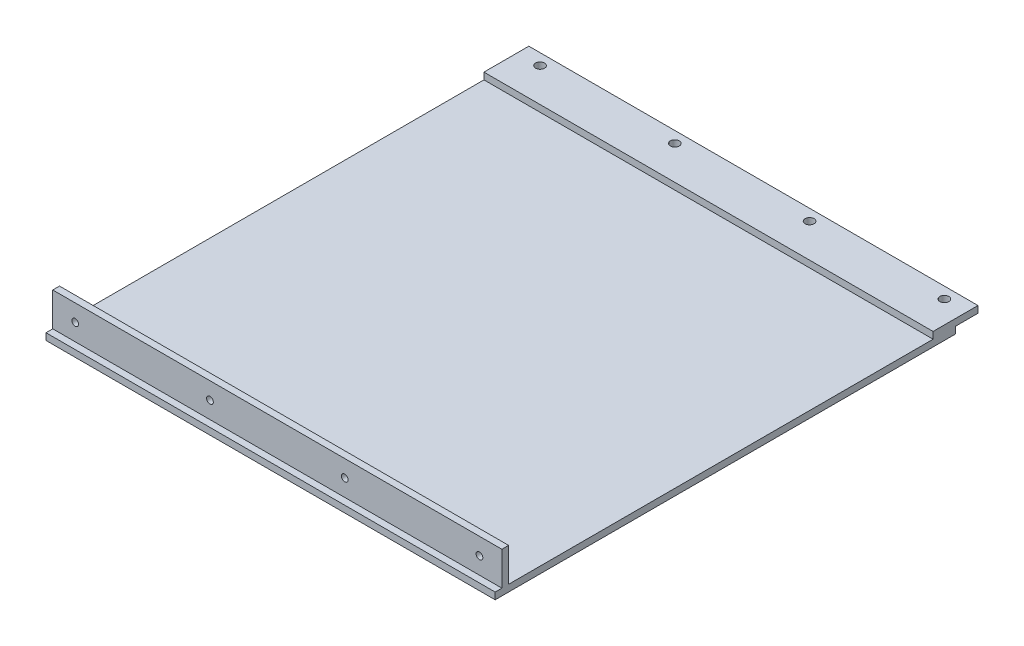
ISO-10303-21;
HEADER;
FILE_DESCRIPTION(('STEP AP214'),'2;1');
FILE_NAME('part.step','',(''),(''),'','','');
FILE_SCHEMA(('AUTOMOTIVE_DESIGN { 1 0 10303 214 1 1 1 1 }'));
ENDSEC;
DATA;
#1=APPLICATION_CONTEXT('core data for automotive mechanical design processes');
#2=APPLICATION_PROTOCOL_DEFINITION('international standard','automotive_design',2000,#1);
#3=PRODUCT_CONTEXT('',#1,'mechanical');
#4=PRODUCT('Part','Part','',(#3));
#5=PRODUCT_RELATED_PRODUCT_CATEGORY('part','',(#4));
#6=PRODUCT_DEFINITION_FORMATION('','',#4);
#7=PRODUCT_DEFINITION_CONTEXT('part definition',#1,'design');
#8=PRODUCT_DEFINITION('design','',#6,#7);
#9=PRODUCT_DEFINITION_SHAPE('','',#8);
#10=(LENGTH_UNIT() NAMED_UNIT(*) SI_UNIT(.MILLI.,.METRE.));
#11=(NAMED_UNIT(*) PLANE_ANGLE_UNIT() SI_UNIT($,.RADIAN.));
#12=(NAMED_UNIT(*) SI_UNIT($,.STERADIAN.) SOLID_ANGLE_UNIT());
#13=UNCERTAINTY_MEASURE_WITH_UNIT(LENGTH_MEASURE(1.E-05),#10,'distance_accuracy_value','');
#14=(GEOMETRIC_REPRESENTATION_CONTEXT(3) GLOBAL_UNCERTAINTY_ASSIGNED_CONTEXT((#13)) GLOBAL_UNIT_ASSIGNED_CONTEXT((#10,
#11,#12)) REPRESENTATION_CONTEXT('',''));
#15=CARTESIAN_POINT('',(0.,0.,0.));
#16=DIRECTION('',(0.,0.,1.));
#17=DIRECTION('',(1.,0.,0.));
#18=AXIS2_PLACEMENT_3D('',#15,#16,#17);
#19=CARTESIAN_POINT('',(0.,3.,0.));
#20=DIRECTION('',(0.,1.,0.));
#21=DIRECTION('',(0.,0.,1.));
#22=AXIS2_PLACEMENT_3D('',#19,#20,#21);
#23=PLANE('',#22);
#24=DIRECTION('',(0.,0.,-1.));
#25=VECTOR('',#24,1.);
#26=CARTESIAN_POINT('',(100.,3.,102.5));
#27=LINE('',#26,#25);
#28=CARTESIAN_POINT('',(100.,3.,102.5));
#29=VERTEX_POINT('',#28);
#30=CARTESIAN_POINT('',(100.,3.,99.5));
#31=VERTEX_POINT('',#30);
#32=EDGE_CURVE('E248',#29,#31,#27,.T.);
#33=ORIENTED_EDGE('',*,*,#32,.T.);
#34=DIRECTION('',(1.,0.,0.));
#35=VECTOR('',#34,1.);
#36=CARTESIAN_POINT('',(-100.,3.,99.5));
#37=LINE('',#36,#35);
#38=CARTESIAN_POINT('',(-100.,3.,99.5));
#39=VERTEX_POINT('',#38);
#40=EDGE_CURVE('E312',#39,#31,#37,.T.);
#41=ORIENTED_EDGE('',*,*,#40,.F.);
#42=DIRECTION('',(0.,0.,-1.));
#43=VECTOR('',#42,1.);
#44=CARTESIAN_POINT('',(-100.,3.,102.5));
#45=LINE('',#44,#43);
#46=CARTESIAN_POINT('',(-100.,3.,102.5));
#47=VERTEX_POINT('',#46);
#48=EDGE_CURVE('E159',#47,#39,#45,.T.);
#49=ORIENTED_EDGE('',*,*,#48,.F.);
#50=DIRECTION('',(1.,0.,0.));
#51=VECTOR('',#50,1.);
#52=CARTESIAN_POINT('',(-100.,3.,102.5));
#53=LINE('',#52,#51);
#54=EDGE_CURVE('E242',#47,#29,#53,.T.);
#55=ORIENTED_EDGE('',*,*,#54,.T.);
#56=EDGE_LOOP('',(#33,#41,#49,#55));
#57=FACE_BOUND('',#56,.T.);
#58=ADVANCED_FACE('F42',(#57),#23,.T.);
#59=CARTESIAN_POINT('',(-100.,3.,96.5));
#60=VERTEX_POINT('',#59);
#61=CARTESIAN_POINT('',(-100.,3.,-92.5));
#62=VERTEX_POINT('',#61);
#63=EDGE_CURVE('E66',#60,#62,#45,.T.);
#64=ORIENTED_EDGE('',*,*,#63,.F.);
#65=DIRECTION('',(-1.,0.,0.));
#66=VECTOR('',#65,1.);
#67=CARTESIAN_POINT('',(-100.,3.,96.5));
#68=LINE('',#67,#66);
#69=CARTESIAN_POINT('',(100.,3.,96.5));
#70=VERTEX_POINT('',#69);
#71=EDGE_CURVE('E153',#70,#60,#68,.T.);
#72=ORIENTED_EDGE('',*,*,#71,.F.);
#73=CARTESIAN_POINT('',(100.,3.,-92.5));
#74=VERTEX_POINT('',#73);
#75=EDGE_CURVE('E246',#70,#74,#27,.T.);
#76=ORIENTED_EDGE('',*,*,#75,.T.);
#77=DIRECTION('',(1.,0.,0.));
#78=VECTOR('',#77,1.);
#79=CARTESIAN_POINT('',(-100.,3.,-92.5));
#80=LINE('',#79,#78);
#81=EDGE_CURVE('E217',#62,#74,#80,.T.);
#82=ORIENTED_EDGE('',*,*,#81,.F.);
#83=EDGE_LOOP('',(#64,#72,#76,#82));
#84=FACE_BOUND('',#83,.T.);
#85=ADVANCED_FACE('F308',(#84),#23,.T.);
#86=CARTESIAN_POINT('',(-100.,3.,102.5));
#87=DIRECTION('',(0.,0.,-1.));
#88=DIRECTION('',(-1.,0.,0.));
#89=AXIS2_PLACEMENT_3D('',#86,#87,#88);
#90=PLANE('',#89);
#91=DIRECTION('',(1.,0.,0.));
#92=VECTOR('',#91,1.);
#93=CARTESIAN_POINT('',(-100.,0.,102.5));
#94=LINE('',#93,#92);
#95=CARTESIAN_POINT('',(-100.,0.,102.5));
#96=VERTEX_POINT('',#95);
#97=CARTESIAN_POINT('',(100.,0.,102.5));
#98=VERTEX_POINT('',#97);
#99=EDGE_CURVE('E241',#96,#98,#94,.T.);
#100=ORIENTED_EDGE('',*,*,#99,.T.);
#101=DIRECTION('',(0.,-1.,0.));
#102=VECTOR('',#101,1.);
#103=CARTESIAN_POINT('',(100.,3.,102.5));
#104=LINE('',#103,#102);
#105=EDGE_CURVE('E11',#29,#98,#104,.T.);
#106=ORIENTED_EDGE('',*,*,#105,.F.);
#107=ORIENTED_EDGE('',*,*,#54,.F.);
#108=DIRECTION('',(0.,-1.,0.));
#109=VECTOR('',#108,1.);
#110=CARTESIAN_POINT('',(-100.,3.,102.5));
#111=LINE('',#110,#109);
#112=EDGE_CURVE('E258',#47,#96,#111,.T.);
#113=ORIENTED_EDGE('',*,*,#112,.T.);
#114=EDGE_LOOP('',(#100,#106,#107,#113));
#115=FACE_BOUND('',#114,.T.);
#116=ADVANCED_FACE('F44',(#115),#90,.F.);
#117=CARTESIAN_POINT('',(100.,3.,102.5));
#118=DIRECTION('',(-1.,0.,0.));
#119=DIRECTION('',(0.,0.,1.));
#120=AXIS2_PLACEMENT_3D('',#117,#118,#119);
#121=PLANE('',#120);
#122=DIRECTION('',(0.,0.,-1.));
#123=VECTOR('',#122,1.);
#124=CARTESIAN_POINT('',(100.,0.,102.5));
#125=LINE('',#124,#123);
#126=CARTESIAN_POINT('',(100.,0.,-102.5));
#127=VERTEX_POINT('',#126);
#128=EDGE_CURVE('E262',#98,#127,#125,.T.);
#129=ORIENTED_EDGE('',*,*,#128,.T.);
#130=DIRECTION('',(0.,-1.,0.));
#131=VECTOR('',#130,1.);
#132=CARTESIAN_POINT('',(100.,3.,-102.5));
#133=LINE('',#132,#131);
#134=CARTESIAN_POINT('',(100.,3.,-102.5));
#135=VERTEX_POINT('',#134);
#136=EDGE_CURVE('E51',#135,#127,#133,.T.);
#137=ORIENTED_EDGE('',*,*,#136,.F.);
#138=DIRECTION('',(0.,0.,-1.));
#139=VECTOR('',#138,1.);
#140=CARTESIAN_POINT('',(100.,3.,-92.5));
#141=LINE('',#140,#139);
#142=CARTESIAN_POINT('',(100.,3.,-112.5));
#143=VERTEX_POINT('',#142);
#144=EDGE_CURVE('E221',#135,#143,#141,.T.);
#145=ORIENTED_EDGE('',*,*,#144,.T.);
#146=DIRECTION('',(0.,-1.,0.));
#147=VECTOR('',#146,1.);
#148=CARTESIAN_POINT('',(100.,6.,-112.5));
#149=LINE('',#148,#147);
#150=CARTESIAN_POINT('',(100.,6.,-112.5));
#151=VERTEX_POINT('',#150);
#152=EDGE_CURVE('E229',#151,#143,#149,.T.);
#153=ORIENTED_EDGE('',*,*,#152,.F.);
#154=DIRECTION('',(0.,0.,-1.));
#155=VECTOR('',#154,1.);
#156=CARTESIAN_POINT('',(100.,6.,-92.5));
#157=LINE('',#156,#155);
#158=CARTESIAN_POINT('',(100.,6.,-92.5));
#159=VERTEX_POINT('',#158);
#160=EDGE_CURVE('E207',#159,#151,#157,.T.);
#161=ORIENTED_EDGE('',*,*,#160,.F.);
#162=DIRECTION('',(0.,-1.,0.));
#163=VECTOR('',#162,1.);
#164=CARTESIAN_POINT('',(100.,6.,-92.5));
#165=LINE('',#164,#163);
#166=EDGE_CURVE('E233',#159,#74,#165,.T.);
#167=ORIENTED_EDGE('',*,*,#166,.T.);
#168=ORIENTED_EDGE('',*,*,#75,.F.);
#169=DIRECTION('',(0.,-1.,0.));
#170=VECTOR('',#169,1.);
#171=CARTESIAN_POINT('',(100.,18.,96.5));
#172=LINE('',#171,#170);
#173=CARTESIAN_POINT('',(100.,18.,96.5));
#174=VERTEX_POINT('',#173);
#175=EDGE_CURVE('E58',#174,#70,#172,.T.);
#176=ORIENTED_EDGE('',*,*,#175,.F.);
#177=DIRECTION('',(0.,0.,-1.));
#178=VECTOR('',#177,1.);
#179=CARTESIAN_POINT('',(100.,18.,99.5));
#180=LINE('',#179,#178);
#181=CARTESIAN_POINT('',(100.,18.,99.5));
#182=VERTEX_POINT('',#181);
#183=EDGE_CURVE('E145',#182,#174,#180,.T.);
#184=ORIENTED_EDGE('',*,*,#183,.F.);
#185=DIRECTION('',(0.,-1.,0.));
#186=VECTOR('',#185,1.);
#187=CARTESIAN_POINT('',(100.,18.,99.5));
#188=LINE('',#187,#186);
#189=EDGE_CURVE('E141',#182,#31,#188,.T.);
#190=ORIENTED_EDGE('',*,*,#189,.T.);
#191=ORIENTED_EDGE('',*,*,#32,.F.);
#192=ORIENTED_EDGE('',*,*,#105,.T.);
#193=EDGE_LOOP('',(#129,#137,#145,#153,#161,#167,#168,#176,#184,#190,#191,#192));
#194=FACE_BOUND('',#193,.T.);
#195=ADVANCED_FACE('F284',(#194),#121,.F.);
#196=CARTESIAN_POINT('',(-100.,3.,-102.5));
#197=DIRECTION('',(0.,0.,-1.));
#198=DIRECTION('',(-1.,0.,0.));
#199=AXIS2_PLACEMENT_3D('',#196,#197,#198);
#200=PLANE('',#199);
#201=DIRECTION('',(1.,0.,0.));
#202=VECTOR('',#201,1.);
#203=CARTESIAN_POINT('',(-100.,0.,-102.5));
#204=LINE('',#203,#202);
#205=CARTESIAN_POINT('',(-100.,0.,-102.5));
#206=VERTEX_POINT('',#205);
#207=EDGE_CURVE('E266',#206,#127,#204,.T.);
#208=ORIENTED_EDGE('',*,*,#207,.F.);
#209=DIRECTION('',(0.,-1.,0.));
#210=VECTOR('',#209,1.);
#211=CARTESIAN_POINT('',(-100.,3.,-102.5));
#212=LINE('',#211,#210);
#213=CARTESIAN_POINT('',(-100.,3.,-102.5));
#214=VERTEX_POINT('',#213);
#215=EDGE_CURVE('E275',#214,#206,#212,.T.);
#216=ORIENTED_EDGE('',*,*,#215,.F.);
#217=DIRECTION('',(1.,0.,0.));
#218=VECTOR('',#217,1.);
#219=CARTESIAN_POINT('',(-100.,3.,-102.5));
#220=LINE('',#219,#218);
#221=EDGE_CURVE('E252',#214,#135,#220,.T.);
#222=ORIENTED_EDGE('',*,*,#221,.T.);
#223=ORIENTED_EDGE('',*,*,#136,.T.);
#224=EDGE_LOOP('',(#208,#216,#222,#223));
#225=FACE_BOUND('',#224,.T.);
#226=ADVANCED_FACE('F280',(#225),#200,.T.);
#227=CARTESIAN_POINT('',(-100.,3.,102.5));
#228=DIRECTION('',(-1.,0.,0.));
#229=DIRECTION('',(0.,0.,1.));
#230=AXIS2_PLACEMENT_3D('',#227,#228,#229);
#231=PLANE('',#230);
#232=DIRECTION('',(0.,0.,-1.));
#233=VECTOR('',#232,1.);
#234=CARTESIAN_POINT('',(-100.,0.,102.5));
#235=LINE('',#234,#233);
#236=EDGE_CURVE('E247',#96,#206,#235,.T.);
#237=ORIENTED_EDGE('',*,*,#236,.F.);
#238=ORIENTED_EDGE('',*,*,#112,.F.);
#239=ORIENTED_EDGE('',*,*,#48,.T.);
#240=DIRECTION('',(0.,-1.,0.));
#241=VECTOR('',#240,1.);
#242=CARTESIAN_POINT('',(-100.,18.,99.5));
#243=LINE('',#242,#241);
#244=CARTESIAN_POINT('',(-100.,18.,99.5));
#245=VERTEX_POINT('',#244);
#246=EDGE_CURVE('E138',#245,#39,#243,.T.);
#247=ORIENTED_EDGE('',*,*,#246,.F.);
#248=DIRECTION('',(0.,0.,1.));
#249=VECTOR('',#248,1.);
#250=CARTESIAN_POINT('',(-100.,18.,99.5));
#251=LINE('',#250,#249);
#252=CARTESIAN_POINT('',(-100.,18.,96.5));
#253=VERTEX_POINT('',#252);
#254=EDGE_CURVE('E146',#253,#245,#251,.T.);
#255=ORIENTED_EDGE('',*,*,#254,.F.);
#256=DIRECTION('',(0.,-1.,0.));
#257=VECTOR('',#256,1.);
#258=CARTESIAN_POINT('',(-100.,18.,96.5));
#259=LINE('',#258,#257);
#260=EDGE_CURVE('E319',#253,#60,#259,.T.);
#261=ORIENTED_EDGE('',*,*,#260,.T.);
#262=ORIENTED_EDGE('',*,*,#63,.T.);
#263=DIRECTION('',(0.,-1.,0.));
#264=VECTOR('',#263,1.);
#265=CARTESIAN_POINT('',(-100.,6.,-92.5));
#266=LINE('',#265,#264);
#267=CARTESIAN_POINT('',(-100.,6.,-92.5));
#268=VERTEX_POINT('',#267);
#269=EDGE_CURVE('E237',#268,#62,#266,.T.);
#270=ORIENTED_EDGE('',*,*,#269,.F.);
#271=DIRECTION('',(0.,0.,1.));
#272=VECTOR('',#271,1.);
#273=CARTESIAN_POINT('',(-100.,6.,-92.5));
#274=LINE('',#273,#272);
#275=CARTESIAN_POINT('',(-100.,6.,-112.5));
#276=VERTEX_POINT('',#275);
#277=EDGE_CURVE('E199',#276,#268,#274,.T.);
#278=ORIENTED_EDGE('',*,*,#277,.F.);
#279=DIRECTION('',(0.,-1.,0.));
#280=VECTOR('',#279,1.);
#281=CARTESIAN_POINT('',(-100.,6.,-112.5));
#282=LINE('',#281,#280);
#283=CARTESIAN_POINT('',(-100.,3.,-112.5));
#284=VERTEX_POINT('',#283);
#285=EDGE_CURVE('E213',#276,#284,#282,.T.);
#286=ORIENTED_EDGE('',*,*,#285,.T.);
#287=DIRECTION('',(0.,0.,1.));
#288=VECTOR('',#287,1.);
#289=CARTESIAN_POINT('',(-100.,3.,-92.5));
#290=LINE('',#289,#288);
#291=EDGE_CURVE('E195',#284,#214,#290,.T.);
#292=ORIENTED_EDGE('',*,*,#291,.T.);
#293=ORIENTED_EDGE('',*,*,#215,.T.);
#294=EDGE_LOOP('',(#237,#238,#239,#247,#255,#261,#262,#270,#278,#286,#292,#293));
#295=FACE_BOUND('',#294,.T.);
#296=ADVANCED_FACE('F157',(#295),#231,.T.);
#297=CARTESIAN_POINT('',(0.,0.,0.));
#298=DIRECTION('',(0.,1.,0.));
#299=DIRECTION('',(0.,0.,1.));
#300=AXIS2_PLACEMENT_3D('',#297,#298,#299);
#301=PLANE('',#300);
#302=ORIENTED_EDGE('',*,*,#99,.F.);
#303=ORIENTED_EDGE('',*,*,#236,.T.);
#304=ORIENTED_EDGE('',*,*,#207,.T.);
#305=ORIENTED_EDGE('',*,*,#128,.F.);
#306=EDGE_LOOP('',(#302,#303,#304,#305));
#307=FACE_BOUND('',#306,.T.);
#308=ADVANCED_FACE('F288',(#307),#301,.F.);
#309=CARTESIAN_POINT('',(0.,3.,0.));
#310=DIRECTION('',(0.,-1.,0.));
#311=DIRECTION('',(0.,0.,-1.));
#312=AXIS2_PLACEMENT_3D('',#309,#310,#311);
#313=PLANE('',#312);
#314=CARTESIAN_POINT('',(90.,3.,-107.5));
#315=DIRECTION('',(0.,-1.,0.));
#316=DIRECTION('',(0.,0.,-1.));
#317=AXIS2_PLACEMENT_3D('',#314,#315,#316);
#318=CIRCLE('',#317,2.);
#319=CARTESIAN_POINT('',(90.,3.,-105.5));
#320=VERTEX_POINT('',#319);
#321=EDGE_CURVE('E161',#320,#320,#318,.F.);
#322=ORIENTED_EDGE('',*,*,#321,.T.);
#323=EDGE_LOOP('',(#322));
#324=FACE_BOUND('',#323,.T.);
#325=CARTESIAN_POINT('',(30.,3.,-107.5));
#326=DIRECTION('',(0.,-1.,0.));
#327=DIRECTION('',(0.,0.,-1.));
#328=AXIS2_PLACEMENT_3D('',#325,#326,#327);
#329=CIRCLE('',#328,2.);
#330=CARTESIAN_POINT('',(30.,3.,-105.5));
#331=VERTEX_POINT('',#330);
#332=EDGE_CURVE('E174',#331,#331,#329,.F.);
#333=ORIENTED_EDGE('',*,*,#332,.T.);
#334=EDGE_LOOP('',(#333));
#335=FACE_BOUND('',#334,.T.);
#336=CARTESIAN_POINT('',(-30.,3.,-107.5));
#337=DIRECTION('',(0.,-1.,0.));
#338=DIRECTION('',(0.,0.,-1.));
#339=AXIS2_PLACEMENT_3D('',#336,#337,#338);
#340=CIRCLE('',#339,2.);
#341=CARTESIAN_POINT('',(-30.,3.,-105.5));
#342=VERTEX_POINT('',#341);
#343=EDGE_CURVE('E182',#342,#342,#340,.F.);
#344=ORIENTED_EDGE('',*,*,#343,.T.);
#345=EDGE_LOOP('',(#344));
#346=FACE_BOUND('',#345,.T.);
#347=CARTESIAN_POINT('',(-90.,3.,-107.5));
#348=DIRECTION('',(0.,-1.,0.));
#349=DIRECTION('',(0.,0.,-1.));
#350=AXIS2_PLACEMENT_3D('',#347,#348,#349);
#351=CIRCLE('',#350,2.);
#352=CARTESIAN_POINT('',(-90.,3.,-105.5));
#353=VERTEX_POINT('',#352);
#354=EDGE_CURVE('E190',#353,#353,#351,.F.);
#355=ORIENTED_EDGE('',*,*,#354,.T.);
#356=EDGE_LOOP('',(#355));
#357=FACE_BOUND('',#356,.T.);
#358=ORIENTED_EDGE('',*,*,#221,.F.);
#359=ORIENTED_EDGE('',*,*,#291,.F.);
#360=DIRECTION('',(-1.,0.,0.));
#361=VECTOR('',#360,1.);
#362=CARTESIAN_POINT('',(-100.,3.,-112.5));
#363=LINE('',#362,#361);
#364=EDGE_CURVE('E204',#143,#284,#363,.T.);
#365=ORIENTED_EDGE('',*,*,#364,.F.);
#366=ORIENTED_EDGE('',*,*,#144,.F.);
#367=EDGE_LOOP('',(#358,#359,#365,#366));
#368=FACE_BOUND('',#367,.T.);
#369=ADVANCED_FACE('F292',(#324,#335,#346,#357,#368),#313,.T.);
#370=CARTESIAN_POINT('',(-100.,6.,-92.5));
#371=DIRECTION('',(0.,0.,-1.));
#372=DIRECTION('',(-1.,0.,0.));
#373=AXIS2_PLACEMENT_3D('',#370,#371,#372);
#374=PLANE('',#373);
#375=ORIENTED_EDGE('',*,*,#81,.T.);
#376=ORIENTED_EDGE('',*,*,#166,.F.);
#377=DIRECTION('',(1.,0.,0.));
#378=VECTOR('',#377,1.);
#379=CARTESIAN_POINT('',(-100.,6.,-92.5));
#380=LINE('',#379,#378);
#381=EDGE_CURVE('E203',#268,#159,#380,.T.);
#382=ORIENTED_EDGE('',*,*,#381,.F.);
#383=ORIENTED_EDGE('',*,*,#269,.T.);
#384=EDGE_LOOP('',(#375,#376,#382,#383));
#385=FACE_BOUND('',#384,.T.);
#386=ADVANCED_FACE('F306',(#385),#374,.F.);
#387=CARTESIAN_POINT('',(-100.,6.,-112.5));
#388=DIRECTION('',(0.,0.,1.));
#389=DIRECTION('',(1.,0.,0.));
#390=AXIS2_PLACEMENT_3D('',#387,#388,#389);
#391=PLANE('',#390);
#392=ORIENTED_EDGE('',*,*,#364,.T.);
#393=ORIENTED_EDGE('',*,*,#285,.F.);
#394=DIRECTION('',(-1.,0.,0.));
#395=VECTOR('',#394,1.);
#396=CARTESIAN_POINT('',(-100.,6.,-112.5));
#397=LINE('',#396,#395);
#398=EDGE_CURVE('E210',#151,#276,#397,.T.);
#399=ORIENTED_EDGE('',*,*,#398,.F.);
#400=ORIENTED_EDGE('',*,*,#152,.T.);
#401=EDGE_LOOP('',(#392,#393,#399,#400));
#402=FACE_BOUND('',#401,.T.);
#403=ADVANCED_FACE('F298',(#402),#391,.F.);
#404=CARTESIAN_POINT('',(0.,6.,0.));
#405=DIRECTION('',(0.,-1.,0.));
#406=DIRECTION('',(0.,0.,-1.));
#407=AXIS2_PLACEMENT_3D('',#404,#405,#406);
#408=PLANE('',#407);
#409=CARTESIAN_POINT('',(90.,6.,-107.5));
#410=DIRECTION('',(0.,1.,0.));
#411=DIRECTION('',(0.,0.,1.));
#412=AXIS2_PLACEMENT_3D('',#409,#410,#411);
#413=CIRCLE('',#412,2.);
#414=CARTESIAN_POINT('',(90.,6.,-105.5));
#415=VERTEX_POINT('',#414);
#416=EDGE_CURVE('E166',#415,#415,#413,.T.);
#417=ORIENTED_EDGE('',*,*,#416,.F.);
#418=EDGE_LOOP('',(#417));
#419=FACE_BOUND('',#418,.T.);
#420=CARTESIAN_POINT('',(30.,6.,-107.5));
#421=DIRECTION('',(0.,1.,0.));
#422=DIRECTION('',(0.,0.,1.));
#423=AXIS2_PLACEMENT_3D('',#420,#421,#422);
#424=CIRCLE('',#423,2.);
#425=CARTESIAN_POINT('',(30.,6.,-105.5));
#426=VERTEX_POINT('',#425);
#427=EDGE_CURVE('E178',#426,#426,#424,.T.);
#428=ORIENTED_EDGE('',*,*,#427,.F.);
#429=EDGE_LOOP('',(#428));
#430=FACE_BOUND('',#429,.T.);
#431=CARTESIAN_POINT('',(-30.,6.,-107.5));
#432=DIRECTION('',(0.,1.,0.));
#433=DIRECTION('',(0.,0.,1.));
#434=AXIS2_PLACEMENT_3D('',#431,#432,#433);
#435=CIRCLE('',#434,2.);
#436=CARTESIAN_POINT('',(-30.,6.,-105.5));
#437=VERTEX_POINT('',#436);
#438=EDGE_CURVE('E186',#437,#437,#435,.T.);
#439=ORIENTED_EDGE('',*,*,#438,.F.);
#440=EDGE_LOOP('',(#439));
#441=FACE_BOUND('',#440,.T.);
#442=CARTESIAN_POINT('',(-90.,6.,-107.5));
#443=DIRECTION('',(0.,1.,0.));
#444=DIRECTION('',(0.,0.,1.));
#445=AXIS2_PLACEMENT_3D('',#442,#443,#444);
#446=CIRCLE('',#445,2.);
#447=CARTESIAN_POINT('',(-90.,6.,-105.5));
#448=VERTEX_POINT('',#447);
#449=EDGE_CURVE('E191',#448,#448,#446,.T.);
#450=ORIENTED_EDGE('',*,*,#449,.F.);
#451=EDGE_LOOP('',(#450));
#452=FACE_BOUND('',#451,.T.);
#453=ORIENTED_EDGE('',*,*,#277,.T.);
#454=ORIENTED_EDGE('',*,*,#381,.T.);
#455=ORIENTED_EDGE('',*,*,#160,.T.);
#456=ORIENTED_EDGE('',*,*,#398,.T.);
#457=EDGE_LOOP('',(#453,#454,#455,#456));
#458=FACE_BOUND('',#457,.T.);
#459=ADVANCED_FACE('F302',(#419,#430,#441,#452,#458),#408,.F.);
#460=CARTESIAN_POINT('',(-90.,-0.00100000000000013,-107.5));
#461=DIRECTION('',(0.,1.,0.));
#462=DIRECTION('',(0.,0.,1.));
#463=AXIS2_PLACEMENT_3D('',#460,#461,#462);
#464=CYLINDRICAL_SURFACE('',#463,2.);
#465=CARTESIAN_POINT('',(-90.,3.,-105.5));
#466=CARTESIAN_POINT('',(-90.,3.03125,-105.5));
#467=CARTESIAN_POINT('',(-90.,3.0625,-105.5));
#468=CARTESIAN_POINT('',(-90.,3.125,-105.5));
#469=CARTESIAN_POINT('',(-90.,3.15625,-105.5));
#470=CARTESIAN_POINT('',(-90.,3.21875,-105.5));
#471=CARTESIAN_POINT('',(-90.,3.25,-105.5));
#472=CARTESIAN_POINT('',(-90.,3.3125,-105.5));
#473=CARTESIAN_POINT('',(-90.,3.34375,-105.5));
#474=CARTESIAN_POINT('',(-90.,3.40625,-105.5));
#475=CARTESIAN_POINT('',(-90.,3.4375,-105.5));
#476=CARTESIAN_POINT('',(-90.,3.5,-105.5));
#477=CARTESIAN_POINT('',(-90.,3.53125,-105.5));
#478=CARTESIAN_POINT('',(-90.,3.59375,-105.5));
#479=CARTESIAN_POINT('',(-90.,3.625,-105.5));
#480=CARTESIAN_POINT('',(-90.,3.6875,-105.5));
#481=CARTESIAN_POINT('',(-90.,3.71875,-105.5));
#482=CARTESIAN_POINT('',(-90.,3.78125,-105.5));
#483=CARTESIAN_POINT('',(-90.,3.8125,-105.5));
#484=CARTESIAN_POINT('',(-90.,3.875,-105.5));
#485=CARTESIAN_POINT('',(-90.,3.90625,-105.5));
#486=CARTESIAN_POINT('',(-90.,3.96875,-105.5));
#487=CARTESIAN_POINT('',(-90.,4.,-105.5));
#488=CARTESIAN_POINT('',(-90.,4.0625,-105.5));
#489=CARTESIAN_POINT('',(-90.,4.09375,-105.5));
#490=CARTESIAN_POINT('',(-90.,4.15625,-105.5));
#491=CARTESIAN_POINT('',(-90.,4.1875,-105.5));
#492=CARTESIAN_POINT('',(-90.,4.25,-105.5));
#493=CARTESIAN_POINT('',(-90.,4.28125,-105.5));
#494=CARTESIAN_POINT('',(-90.,4.34375,-105.5));
#495=CARTESIAN_POINT('',(-90.,4.375,-105.5));
#496=CARTESIAN_POINT('',(-90.,4.4375,-105.5));
#497=CARTESIAN_POINT('',(-90.,4.46875,-105.5));
#498=CARTESIAN_POINT('',(-90.,4.53125,-105.5));
#499=CARTESIAN_POINT('',(-90.,4.5625,-105.5));
#500=CARTESIAN_POINT('',(-90.,4.625,-105.5));
#501=CARTESIAN_POINT('',(-90.,4.65625,-105.5));
#502=CARTESIAN_POINT('',(-90.,4.71875,-105.5));
#503=CARTESIAN_POINT('',(-90.,4.75,-105.5));
#504=CARTESIAN_POINT('',(-90.,4.8125,-105.5));
#505=CARTESIAN_POINT('',(-90.,4.84375,-105.5));
#506=CARTESIAN_POINT('',(-90.,4.90625,-105.5));
#507=CARTESIAN_POINT('',(-90.,4.9375,-105.5));
#508=CARTESIAN_POINT('',(-90.,5.,-105.5));
#509=CARTESIAN_POINT('',(-90.,5.03125,-105.5));
#510=CARTESIAN_POINT('',(-90.,5.09375,-105.5));
#511=CARTESIAN_POINT('',(-90.,5.125,-105.5));
#512=CARTESIAN_POINT('',(-90.,5.1875,-105.5));
#513=CARTESIAN_POINT('',(-90.,5.21875,-105.5));
#514=CARTESIAN_POINT('',(-90.,5.28125,-105.5));
#515=CARTESIAN_POINT('',(-90.,5.3125,-105.5));
#516=CARTESIAN_POINT('',(-90.,5.375,-105.5));
#517=CARTESIAN_POINT('',(-90.,5.40625,-105.5));
#518=CARTESIAN_POINT('',(-90.,5.46875,-105.5));
#519=CARTESIAN_POINT('',(-90.,5.5,-105.5));
#520=CARTESIAN_POINT('',(-90.,5.5625,-105.5));
#521=CARTESIAN_POINT('',(-90.,5.59375,-105.5));
#522=CARTESIAN_POINT('',(-90.,5.65625,-105.5));
#523=CARTESIAN_POINT('',(-90.,5.6875,-105.5));
#524=CARTESIAN_POINT('',(-90.,5.75,-105.5));
#525=CARTESIAN_POINT('',(-90.,5.78125,-105.5));
#526=CARTESIAN_POINT('',(-90.,5.84375,-105.5));
#527=CARTESIAN_POINT('',(-90.,5.875,-105.5));
#528=CARTESIAN_POINT('',(-90.,5.9375,-105.5));
#529=CARTESIAN_POINT('',(-90.,5.96875,-105.5));
#530=CARTESIAN_POINT('',(-90.,6.,-105.5));
#531=B_SPLINE_CURVE_WITH_KNOTS('',3,(#465,#466,#467,#468,#469,#470,#471,#472,#473,#474,#475,
#476,#477,#478,#479,#480,#481,#482,#483,#484,#485,#486,#487,#488,#489,#490,#491,#492,#493,#494,
#495,#496,#497,#498,#499,#500,#501,#502,#503,#504,#505,#506,#507,#508,#509,#510,#511,#512,#513,
#514,#515,#516,#517,#518,#519,#520,#521,#522,#523,#524,#525,#526,#527,#528,#529,#530),
.UNSPECIFIED.,.F.,.F.,(4,2,2,2,2,2,2,2,2,2,2,2,2,2,2,2,2,2,2,2,2,2,2,2,2,2,2,2,2,2,2,2,4),(0.,
0.0937500000000001,0.1875,0.28125,0.375,0.46875,0.5625,0.65625,0.75,0.84375,0.9375,1.03125,
1.125,1.21875,1.3125,1.40625,1.5,1.59375,1.6875,1.78125,1.875,1.96875,2.0625,2.15625,2.25,
2.34375,2.4375,2.53125,2.625,2.71875,2.8125,2.90625,3.),.UNSPECIFIED.);
#532=EDGE_CURVE('BSEAM444',#353,#448,#531,.T.);
#533=ORIENTED_EDGE('',*,*,#354,.F.);
#534=ORIENTED_EDGE('',*,*,#449,.T.);
#535=ORIENTED_EDGE('',*,*,#532,.T.);
#536=ORIENTED_EDGE('',*,*,#532,.F.);
#537=EDGE_LOOP('',(#533,#535,#534,#536));
#538=FACE_BOUND('',#537,.T.);
#539=ADVANCED_FACE('F444',(#538),#464,.F.);
#540=CARTESIAN_POINT('',(-30.,-0.00100000000000013,-107.5));
#541=DIRECTION('',(0.,1.,0.));
#542=DIRECTION('',(0.,0.,1.));
#543=AXIS2_PLACEMENT_3D('',#540,#541,#542);
#544=CYLINDRICAL_SURFACE('',#543,2.);
#545=CARTESIAN_POINT('',(-30.,3.,-105.5));
#546=CARTESIAN_POINT('',(-30.,3.03125,-105.5));
#547=CARTESIAN_POINT('',(-30.,3.0625,-105.5));
#548=CARTESIAN_POINT('',(-30.,3.125,-105.5));
#549=CARTESIAN_POINT('',(-30.,3.15625,-105.5));
#550=CARTESIAN_POINT('',(-30.,3.21875,-105.5));
#551=CARTESIAN_POINT('',(-30.,3.25,-105.5));
#552=CARTESIAN_POINT('',(-30.,3.3125,-105.5));
#553=CARTESIAN_POINT('',(-30.,3.34375,-105.5));
#554=CARTESIAN_POINT('',(-30.,3.40625,-105.5));
#555=CARTESIAN_POINT('',(-30.,3.4375,-105.5));
#556=CARTESIAN_POINT('',(-30.,3.5,-105.5));
#557=CARTESIAN_POINT('',(-30.,3.53125,-105.5));
#558=CARTESIAN_POINT('',(-30.,3.59375,-105.5));
#559=CARTESIAN_POINT('',(-30.,3.625,-105.5));
#560=CARTESIAN_POINT('',(-30.,3.6875,-105.5));
#561=CARTESIAN_POINT('',(-30.,3.71875,-105.5));
#562=CARTESIAN_POINT('',(-30.,3.78125,-105.5));
#563=CARTESIAN_POINT('',(-30.,3.8125,-105.5));
#564=CARTESIAN_POINT('',(-30.,3.875,-105.5));
#565=CARTESIAN_POINT('',(-30.,3.90625,-105.5));
#566=CARTESIAN_POINT('',(-30.,3.96875,-105.5));
#567=CARTESIAN_POINT('',(-30.,4.,-105.5));
#568=CARTESIAN_POINT('',(-30.,4.0625,-105.5));
#569=CARTESIAN_POINT('',(-30.,4.09375,-105.5));
#570=CARTESIAN_POINT('',(-30.,4.15625,-105.5));
#571=CARTESIAN_POINT('',(-30.,4.1875,-105.5));
#572=CARTESIAN_POINT('',(-30.,4.25,-105.5));
#573=CARTESIAN_POINT('',(-30.,4.28125,-105.5));
#574=CARTESIAN_POINT('',(-30.,4.34375,-105.5));
#575=CARTESIAN_POINT('',(-30.,4.375,-105.5));
#576=CARTESIAN_POINT('',(-30.,4.4375,-105.5));
#577=CARTESIAN_POINT('',(-30.,4.46875,-105.5));
#578=CARTESIAN_POINT('',(-30.,4.53125,-105.5));
#579=CARTESIAN_POINT('',(-30.,4.5625,-105.5));
#580=CARTESIAN_POINT('',(-30.,4.625,-105.5));
#581=CARTESIAN_POINT('',(-30.,4.65625,-105.5));
#582=CARTESIAN_POINT('',(-30.,4.71875,-105.5));
#583=CARTESIAN_POINT('',(-30.,4.75,-105.5));
#584=CARTESIAN_POINT('',(-30.,4.8125,-105.5));
#585=CARTESIAN_POINT('',(-30.,4.84375,-105.5));
#586=CARTESIAN_POINT('',(-30.,4.90625,-105.5));
#587=CARTESIAN_POINT('',(-30.,4.9375,-105.5));
#588=CARTESIAN_POINT('',(-30.,5.,-105.5));
#589=CARTESIAN_POINT('',(-30.,5.03125,-105.5));
#590=CARTESIAN_POINT('',(-30.,5.09375,-105.5));
#591=CARTESIAN_POINT('',(-30.,5.125,-105.5));
#592=CARTESIAN_POINT('',(-30.,5.1875,-105.5));
#593=CARTESIAN_POINT('',(-30.,5.21875,-105.5));
#594=CARTESIAN_POINT('',(-30.,5.28125,-105.5));
#595=CARTESIAN_POINT('',(-30.,5.3125,-105.5));
#596=CARTESIAN_POINT('',(-30.,5.375,-105.5));
#597=CARTESIAN_POINT('',(-30.,5.40625,-105.5));
#598=CARTESIAN_POINT('',(-30.,5.46875,-105.5));
#599=CARTESIAN_POINT('',(-30.,5.5,-105.5));
#600=CARTESIAN_POINT('',(-30.,5.5625,-105.5));
#601=CARTESIAN_POINT('',(-30.,5.59375,-105.5));
#602=CARTESIAN_POINT('',(-30.,5.65625,-105.5));
#603=CARTESIAN_POINT('',(-30.,5.6875,-105.5));
#604=CARTESIAN_POINT('',(-30.,5.75,-105.5));
#605=CARTESIAN_POINT('',(-30.,5.78125,-105.5));
#606=CARTESIAN_POINT('',(-30.,5.84375,-105.5));
#607=CARTESIAN_POINT('',(-30.,5.875,-105.5));
#608=CARTESIAN_POINT('',(-30.,5.9375,-105.5));
#609=CARTESIAN_POINT('',(-30.,5.96875,-105.5));
#610=CARTESIAN_POINT('',(-30.,6.,-105.5));
#611=B_SPLINE_CURVE_WITH_KNOTS('',3,(#545,#546,#547,#548,#549,#550,#551,#552,#553,#554,#555,
#556,#557,#558,#559,#560,#561,#562,#563,#564,#565,#566,#567,#568,#569,#570,#571,#572,#573,#574,
#575,#576,#577,#578,#579,#580,#581,#582,#583,#584,#585,#586,#587,#588,#589,#590,#591,#592,#593,
#594,#595,#596,#597,#598,#599,#600,#601,#602,#603,#604,#605,#606,#607,#608,#609,#610),
.UNSPECIFIED.,.F.,.F.,(4,2,2,2,2,2,2,2,2,2,2,2,2,2,2,2,2,2,2,2,2,2,2,2,2,2,2,2,2,2,2,2,4),(0.,
0.0937500000000001,0.1875,0.28125,0.375,0.46875,0.5625,0.65625,0.75,0.84375,0.9375,1.03125,
1.125,1.21875,1.3125,1.40625,1.5,1.59375,1.6875,1.78125,1.875,1.96875,2.0625,2.15625,2.25,
2.34375,2.4375,2.53125,2.625,2.71875,2.8125,2.90625,3.),.UNSPECIFIED.);
#612=EDGE_CURVE('BSEAM452',#342,#437,#611,.T.);
#613=ORIENTED_EDGE('',*,*,#343,.F.);
#614=ORIENTED_EDGE('',*,*,#438,.T.);
#615=ORIENTED_EDGE('',*,*,#612,.T.);
#616=ORIENTED_EDGE('',*,*,#612,.F.);
#617=EDGE_LOOP('',(#613,#615,#614,#616));
#618=FACE_BOUND('',#617,.T.);
#619=ADVANCED_FACE('F452',(#618),#544,.F.);
#620=CARTESIAN_POINT('',(30.,-0.00100000000000013,-107.5));
#621=DIRECTION('',(0.,1.,0.));
#622=DIRECTION('',(0.,0.,1.));
#623=AXIS2_PLACEMENT_3D('',#620,#621,#622);
#624=CYLINDRICAL_SURFACE('',#623,2.);
#625=CARTESIAN_POINT('',(30.,3.,-105.5));
#626=CARTESIAN_POINT('',(30.,3.03125,-105.5));
#627=CARTESIAN_POINT('',(30.,3.0625,-105.5));
#628=CARTESIAN_POINT('',(30.,3.125,-105.5));
#629=CARTESIAN_POINT('',(30.,3.15625,-105.5));
#630=CARTESIAN_POINT('',(30.,3.21875,-105.5));
#631=CARTESIAN_POINT('',(30.,3.25,-105.5));
#632=CARTESIAN_POINT('',(30.,3.3125,-105.5));
#633=CARTESIAN_POINT('',(30.,3.34375,-105.5));
#634=CARTESIAN_POINT('',(30.,3.40625,-105.5));
#635=CARTESIAN_POINT('',(30.,3.4375,-105.5));
#636=CARTESIAN_POINT('',(30.,3.5,-105.5));
#637=CARTESIAN_POINT('',(30.,3.53125,-105.5));
#638=CARTESIAN_POINT('',(30.,3.59375,-105.5));
#639=CARTESIAN_POINT('',(30.,3.625,-105.5));
#640=CARTESIAN_POINT('',(30.,3.6875,-105.5));
#641=CARTESIAN_POINT('',(30.,3.71875,-105.5));
#642=CARTESIAN_POINT('',(30.,3.78125,-105.5));
#643=CARTESIAN_POINT('',(30.,3.8125,-105.5));
#644=CARTESIAN_POINT('',(30.,3.875,-105.5));
#645=CARTESIAN_POINT('',(30.,3.90625,-105.5));
#646=CARTESIAN_POINT('',(30.,3.96875,-105.5));
#647=CARTESIAN_POINT('',(30.,4.,-105.5));
#648=CARTESIAN_POINT('',(30.,4.0625,-105.5));
#649=CARTESIAN_POINT('',(30.,4.09375,-105.5));
#650=CARTESIAN_POINT('',(30.,4.15625,-105.5));
#651=CARTESIAN_POINT('',(30.,4.1875,-105.5));
#652=CARTESIAN_POINT('',(30.,4.25,-105.5));
#653=CARTESIAN_POINT('',(30.,4.28125,-105.5));
#654=CARTESIAN_POINT('',(30.,4.34375,-105.5));
#655=CARTESIAN_POINT('',(30.,4.375,-105.5));
#656=CARTESIAN_POINT('',(30.,4.4375,-105.5));
#657=CARTESIAN_POINT('',(30.,4.46875,-105.5));
#658=CARTESIAN_POINT('',(30.,4.53125,-105.5));
#659=CARTESIAN_POINT('',(30.,4.5625,-105.5));
#660=CARTESIAN_POINT('',(30.,4.625,-105.5));
#661=CARTESIAN_POINT('',(30.,4.65625,-105.5));
#662=CARTESIAN_POINT('',(30.,4.71875,-105.5));
#663=CARTESIAN_POINT('',(30.,4.75,-105.5));
#664=CARTESIAN_POINT('',(30.,4.8125,-105.5));
#665=CARTESIAN_POINT('',(30.,4.84375,-105.5));
#666=CARTESIAN_POINT('',(30.,4.90625,-105.5));
#667=CARTESIAN_POINT('',(30.,4.9375,-105.5));
#668=CARTESIAN_POINT('',(30.,5.,-105.5));
#669=CARTESIAN_POINT('',(30.,5.03125,-105.5));
#670=CARTESIAN_POINT('',(30.,5.09375,-105.5));
#671=CARTESIAN_POINT('',(30.,5.125,-105.5));
#672=CARTESIAN_POINT('',(30.,5.1875,-105.5));
#673=CARTESIAN_POINT('',(30.,5.21875,-105.5));
#674=CARTESIAN_POINT('',(30.,5.28125,-105.5));
#675=CARTESIAN_POINT('',(30.,5.3125,-105.5));
#676=CARTESIAN_POINT('',(30.,5.375,-105.5));
#677=CARTESIAN_POINT('',(30.,5.40625,-105.5));
#678=CARTESIAN_POINT('',(30.,5.46875,-105.5));
#679=CARTESIAN_POINT('',(30.,5.5,-105.5));
#680=CARTESIAN_POINT('',(30.,5.5625,-105.5));
#681=CARTESIAN_POINT('',(30.,5.59375,-105.5));
#682=CARTESIAN_POINT('',(30.,5.65625,-105.5));
#683=CARTESIAN_POINT('',(30.,5.6875,-105.5));
#684=CARTESIAN_POINT('',(30.,5.75,-105.5));
#685=CARTESIAN_POINT('',(30.,5.78125,-105.5));
#686=CARTESIAN_POINT('',(30.,5.84375,-105.5));
#687=CARTESIAN_POINT('',(30.,5.875,-105.5));
#688=CARTESIAN_POINT('',(30.,5.9375,-105.5));
#689=CARTESIAN_POINT('',(30.,5.96875,-105.5));
#690=CARTESIAN_POINT('',(30.,6.,-105.5));
#691=B_SPLINE_CURVE_WITH_KNOTS('',3,(#625,#626,#627,#628,#629,#630,#631,#632,#633,#634,#635,
#636,#637,#638,#639,#640,#641,#642,#643,#644,#645,#646,#647,#648,#649,#650,#651,#652,#653,#654,
#655,#656,#657,#658,#659,#660,#661,#662,#663,#664,#665,#666,#667,#668,#669,#670,#671,#672,#673,
#674,#675,#676,#677,#678,#679,#680,#681,#682,#683,#684,#685,#686,#687,#688,#689,#690),
.UNSPECIFIED.,.F.,.F.,(4,2,2,2,2,2,2,2,2,2,2,2,2,2,2,2,2,2,2,2,2,2,2,2,2,2,2,2,2,2,2,2,4),(0.,
0.0937500000000001,0.1875,0.28125,0.375,0.46875,0.5625,0.65625,0.75,0.84375,0.9375,1.03125,
1.125,1.21875,1.3125,1.40625,1.5,1.59375,1.6875,1.78125,1.875,1.96875,2.0625,2.15625,2.25,
2.34375,2.4375,2.53125,2.625,2.71875,2.8125,2.90625,3.),.UNSPECIFIED.);
#692=EDGE_CURVE('BSEAM459',#331,#426,#691,.T.);
#693=ORIENTED_EDGE('',*,*,#332,.F.);
#694=ORIENTED_EDGE('',*,*,#427,.T.);
#695=ORIENTED_EDGE('',*,*,#692,.T.);
#696=ORIENTED_EDGE('',*,*,#692,.F.);
#697=EDGE_LOOP('',(#693,#695,#694,#696));
#698=FACE_BOUND('',#697,.T.);
#699=ADVANCED_FACE('F459',(#698),#624,.F.);
#700=CARTESIAN_POINT('',(90.,-0.00100000000000013,-107.5));
#701=DIRECTION('',(0.,1.,0.));
#702=DIRECTION('',(0.,0.,1.));
#703=AXIS2_PLACEMENT_3D('',#700,#701,#702);
#704=CYLINDRICAL_SURFACE('',#703,2.);
#705=CARTESIAN_POINT('',(90.,3.,-105.5));
#706=CARTESIAN_POINT('',(90.,3.03125,-105.5));
#707=CARTESIAN_POINT('',(90.,3.0625,-105.5));
#708=CARTESIAN_POINT('',(90.,3.125,-105.5));
#709=CARTESIAN_POINT('',(90.,3.15625,-105.5));
#710=CARTESIAN_POINT('',(90.,3.21875,-105.5));
#711=CARTESIAN_POINT('',(90.,3.25,-105.5));
#712=CARTESIAN_POINT('',(90.,3.3125,-105.5));
#713=CARTESIAN_POINT('',(90.,3.34375,-105.5));
#714=CARTESIAN_POINT('',(90.,3.40625,-105.5));
#715=CARTESIAN_POINT('',(90.,3.4375,-105.5));
#716=CARTESIAN_POINT('',(90.,3.5,-105.5));
#717=CARTESIAN_POINT('',(90.,3.53125,-105.5));
#718=CARTESIAN_POINT('',(90.,3.59375,-105.5));
#719=CARTESIAN_POINT('',(90.,3.625,-105.5));
#720=CARTESIAN_POINT('',(90.,3.6875,-105.5));
#721=CARTESIAN_POINT('',(90.,3.71875,-105.5));
#722=CARTESIAN_POINT('',(90.,3.78125,-105.5));
#723=CARTESIAN_POINT('',(90.,3.8125,-105.5));
#724=CARTESIAN_POINT('',(90.,3.875,-105.5));
#725=CARTESIAN_POINT('',(90.,3.90625,-105.5));
#726=CARTESIAN_POINT('',(90.,3.96875,-105.5));
#727=CARTESIAN_POINT('',(90.,4.,-105.5));
#728=CARTESIAN_POINT('',(90.,4.0625,-105.5));
#729=CARTESIAN_POINT('',(90.,4.09375,-105.5));
#730=CARTESIAN_POINT('',(90.,4.15625,-105.5));
#731=CARTESIAN_POINT('',(90.,4.1875,-105.5));
#732=CARTESIAN_POINT('',(90.,4.25,-105.5));
#733=CARTESIAN_POINT('',(90.,4.28125,-105.5));
#734=CARTESIAN_POINT('',(90.,4.34375,-105.5));
#735=CARTESIAN_POINT('',(90.,4.375,-105.5));
#736=CARTESIAN_POINT('',(90.,4.4375,-105.5));
#737=CARTESIAN_POINT('',(90.,4.46875,-105.5));
#738=CARTESIAN_POINT('',(90.,4.53125,-105.5));
#739=CARTESIAN_POINT('',(90.,4.5625,-105.5));
#740=CARTESIAN_POINT('',(90.,4.625,-105.5));
#741=CARTESIAN_POINT('',(90.,4.65625,-105.5));
#742=CARTESIAN_POINT('',(90.,4.71875,-105.5));
#743=CARTESIAN_POINT('',(90.,4.75,-105.5));
#744=CARTESIAN_POINT('',(90.,4.8125,-105.5));
#745=CARTESIAN_POINT('',(90.,4.84375,-105.5));
#746=CARTESIAN_POINT('',(90.,4.90625,-105.5));
#747=CARTESIAN_POINT('',(90.,4.9375,-105.5));
#748=CARTESIAN_POINT('',(90.,5.,-105.5));
#749=CARTESIAN_POINT('',(90.,5.03125,-105.5));
#750=CARTESIAN_POINT('',(90.,5.09375,-105.5));
#751=CARTESIAN_POINT('',(90.,5.125,-105.5));
#752=CARTESIAN_POINT('',(90.,5.1875,-105.5));
#753=CARTESIAN_POINT('',(90.,5.21875,-105.5));
#754=CARTESIAN_POINT('',(90.,5.28125,-105.5));
#755=CARTESIAN_POINT('',(90.,5.3125,-105.5));
#756=CARTESIAN_POINT('',(90.,5.375,-105.5));
#757=CARTESIAN_POINT('',(90.,5.40625,-105.5));
#758=CARTESIAN_POINT('',(90.,5.46875,-105.5));
#759=CARTESIAN_POINT('',(90.,5.5,-105.5));
#760=CARTESIAN_POINT('',(90.,5.5625,-105.5));
#761=CARTESIAN_POINT('',(90.,5.59375,-105.5));
#762=CARTESIAN_POINT('',(90.,5.65625,-105.5));
#763=CARTESIAN_POINT('',(90.,5.6875,-105.5));
#764=CARTESIAN_POINT('',(90.,5.75,-105.5));
#765=CARTESIAN_POINT('',(90.,5.78125,-105.5));
#766=CARTESIAN_POINT('',(90.,5.84375,-105.5));
#767=CARTESIAN_POINT('',(90.,5.875,-105.5));
#768=CARTESIAN_POINT('',(90.,5.9375,-105.5));
#769=CARTESIAN_POINT('',(90.,5.96875,-105.5));
#770=CARTESIAN_POINT('',(90.,6.,-105.5));
#771=B_SPLINE_CURVE_WITH_KNOTS('',3,(#705,#706,#707,#708,#709,#710,#711,#712,#713,#714,#715,
#716,#717,#718,#719,#720,#721,#722,#723,#724,#725,#726,#727,#728,#729,#730,#731,#732,#733,#734,
#735,#736,#737,#738,#739,#740,#741,#742,#743,#744,#745,#746,#747,#748,#749,#750,#751,#752,#753,
#754,#755,#756,#757,#758,#759,#760,#761,#762,#763,#764,#765,#766,#767,#768,#769,#770),
.UNSPECIFIED.,.F.,.F.,(4,2,2,2,2,2,2,2,2,2,2,2,2,2,2,2,2,2,2,2,2,2,2,2,2,2,2,2,2,2,2,2,4),(0.,
0.0937500000000001,0.1875,0.28125,0.375,0.46875,0.5625,0.65625,0.75,0.84375,0.9375,1.03125,
1.125,1.21875,1.3125,1.40625,1.5,1.59375,1.6875,1.78125,1.875,1.96875,2.0625,2.15625,2.25,
2.34375,2.4375,2.53125,2.625,2.71875,2.8125,2.90625,3.),.UNSPECIFIED.);
#772=EDGE_CURVE('BSEAM364',#320,#415,#771,.T.);
#773=ORIENTED_EDGE('',*,*,#321,.F.);
#774=ORIENTED_EDGE('',*,*,#416,.T.);
#775=ORIENTED_EDGE('',*,*,#772,.T.);
#776=ORIENTED_EDGE('',*,*,#772,.F.);
#777=EDGE_LOOP('',(#773,#775,#774,#776));
#778=FACE_BOUND('',#777,.T.);
#779=ADVANCED_FACE('F364',(#778),#704,.F.);
#780=CARTESIAN_POINT('',(-100.,18.,99.5));
#781=DIRECTION('',(0.,0.,-1.));
#782=DIRECTION('',(-1.,0.,0.));
#783=AXIS2_PLACEMENT_3D('',#780,#781,#782);
#784=PLANE('',#783);
#785=CARTESIAN_POINT('',(90.,10.5,99.5));
#786=DIRECTION('',(0.,0.,1.));
#787=DIRECTION('',(1.,0.,0.));
#788=AXIS2_PLACEMENT_3D('',#785,#786,#787);
#789=CIRCLE('',#788,1.5);
#790=CARTESIAN_POINT('',(91.5,10.5,99.5));
#791=VERTEX_POINT('',#790);
#792=EDGE_CURVE('E353',#791,#791,#789,.T.);
#793=ORIENTED_EDGE('',*,*,#792,.F.);
#794=EDGE_LOOP('',(#793));
#795=FACE_BOUND('',#794,.T.);
#796=CARTESIAN_POINT('',(30.,10.5,99.5));
#797=DIRECTION('',(0.,0.,1.));
#798=DIRECTION('',(1.,0.,0.));
#799=AXIS2_PLACEMENT_3D('',#796,#797,#798);
#800=CIRCLE('',#799,1.5);
#801=CARTESIAN_POINT('',(31.5,10.5,99.5));
#802=VERTEX_POINT('',#801);
#803=EDGE_CURVE('E345',#802,#802,#800,.T.);
#804=ORIENTED_EDGE('',*,*,#803,.F.);
#805=EDGE_LOOP('',(#804));
#806=FACE_BOUND('',#805,.T.);
#807=CARTESIAN_POINT('',(-30.,10.5,99.5));
#808=DIRECTION('',(0.,0.,1.));
#809=DIRECTION('',(1.,0.,0.));
#810=AXIS2_PLACEMENT_3D('',#807,#808,#809);
#811=CIRCLE('',#810,1.5);
#812=CARTESIAN_POINT('',(-28.5,10.5,99.5));
#813=VERTEX_POINT('',#812);
#814=EDGE_CURVE('E337',#813,#813,#811,.T.);
#815=ORIENTED_EDGE('',*,*,#814,.F.);
#816=EDGE_LOOP('',(#815));
#817=FACE_BOUND('',#816,.T.);
#818=CARTESIAN_POINT('',(-90.,10.5,99.5));
#819=DIRECTION('',(0.,0.,1.));
#820=DIRECTION('',(1.,0.,0.));
#821=AXIS2_PLACEMENT_3D('',#818,#819,#820);
#822=CIRCLE('',#821,1.5);
#823=CARTESIAN_POINT('',(-88.5,10.5,99.5));
#824=VERTEX_POINT('',#823);
#825=EDGE_CURVE('E329',#824,#824,#822,.T.);
#826=ORIENTED_EDGE('',*,*,#825,.F.);
#827=EDGE_LOOP('',(#826));
#828=FACE_BOUND('',#827,.T.);
#829=ORIENTED_EDGE('',*,*,#40,.T.);
#830=ORIENTED_EDGE('',*,*,#189,.F.);
#831=DIRECTION('',(1.,0.,0.));
#832=VECTOR('',#831,1.);
#833=CARTESIAN_POINT('',(-100.,18.,99.5));
#834=LINE('',#833,#832);
#835=EDGE_CURVE('E134',#245,#182,#834,.T.);
#836=ORIENTED_EDGE('',*,*,#835,.F.);
#837=ORIENTED_EDGE('',*,*,#246,.T.);
#838=EDGE_LOOP('',(#829,#830,#836,#837));
#839=FACE_BOUND('',#838,.T.);
#840=ADVANCED_FACE('F136',(#795,#806,#817,#828,#839),#784,.F.);
#841=CARTESIAN_POINT('',(-100.,18.,96.5));
#842=DIRECTION('',(0.,0.,1.));
#843=DIRECTION('',(1.,0.,0.));
#844=AXIS2_PLACEMENT_3D('',#841,#842,#843);
#845=PLANE('',#844);
#846=CARTESIAN_POINT('',(90.,10.5,96.5));
#847=DIRECTION('',(0.,0.,1.));
#848=DIRECTION('',(1.,0.,0.));
#849=AXIS2_PLACEMENT_3D('',#846,#847,#848);
#850=CIRCLE('',#849,1.5);
#851=CARTESIAN_POINT('',(91.5,10.5,96.5));
#852=VERTEX_POINT('',#851);
#853=EDGE_CURVE('E349',#852,#852,#850,.F.);
#854=ORIENTED_EDGE('',*,*,#853,.F.);
#855=EDGE_LOOP('',(#854));
#856=FACE_BOUND('',#855,.T.);
#857=CARTESIAN_POINT('',(30.,10.5,96.5));
#858=DIRECTION('',(0.,0.,1.));
#859=DIRECTION('',(1.,0.,0.));
#860=AXIS2_PLACEMENT_3D('',#857,#858,#859);
#861=CIRCLE('',#860,1.5);
#862=CARTESIAN_POINT('',(31.5,10.5,96.5));
#863=VERTEX_POINT('',#862);
#864=EDGE_CURVE('E341',#863,#863,#861,.F.);
#865=ORIENTED_EDGE('',*,*,#864,.F.);
#866=EDGE_LOOP('',(#865));
#867=FACE_BOUND('',#866,.T.);
#868=CARTESIAN_POINT('',(-30.,10.5,96.5));
#869=DIRECTION('',(0.,0.,1.));
#870=DIRECTION('',(1.,0.,0.));
#871=AXIS2_PLACEMENT_3D('',#868,#869,#870);
#872=CIRCLE('',#871,1.5);
#873=CARTESIAN_POINT('',(-28.5,10.5,96.5));
#874=VERTEX_POINT('',#873);
#875=EDGE_CURVE('E333',#874,#874,#872,.F.);
#876=ORIENTED_EDGE('',*,*,#875,.F.);
#877=EDGE_LOOP('',(#876));
#878=FACE_BOUND('',#877,.T.);
#879=CARTESIAN_POINT('',(-90.,10.5,96.5));
#880=DIRECTION('',(0.,0.,1.));
#881=DIRECTION('',(1.,0.,0.));
#882=AXIS2_PLACEMENT_3D('',#879,#880,#881);
#883=CIRCLE('',#882,1.5);
#884=CARTESIAN_POINT('',(-88.5,10.5,96.5));
#885=VERTEX_POINT('',#884);
#886=EDGE_CURVE('E315',#885,#885,#883,.F.);
#887=ORIENTED_EDGE('',*,*,#886,.F.);
#888=EDGE_LOOP('',(#887));
#889=FACE_BOUND('',#888,.T.);
#890=ORIENTED_EDGE('',*,*,#71,.T.);
#891=ORIENTED_EDGE('',*,*,#260,.F.);
#892=DIRECTION('',(-1.,0.,0.));
#893=VECTOR('',#892,1.);
#894=CARTESIAN_POINT('',(-100.,18.,96.5));
#895=LINE('',#894,#893);
#896=EDGE_CURVE('E150',#174,#253,#895,.T.);
#897=ORIENTED_EDGE('',*,*,#896,.F.);
#898=ORIENTED_EDGE('',*,*,#175,.T.);
#899=EDGE_LOOP('',(#890,#891,#897,#898));
#900=FACE_BOUND('',#899,.T.);
#901=ADVANCED_FACE('F363',(#856,#867,#878,#889,#900),#845,.F.);
#902=CARTESIAN_POINT('',(0.,18.,0.));
#903=DIRECTION('',(0.,-1.,0.));
#904=DIRECTION('',(0.,0.,-1.));
#905=AXIS2_PLACEMENT_3D('',#902,#903,#904);
#906=PLANE('',#905);
#907=ORIENTED_EDGE('',*,*,#254,.T.);
#908=ORIENTED_EDGE('',*,*,#835,.T.);
#909=ORIENTED_EDGE('',*,*,#183,.T.);
#910=ORIENTED_EDGE('',*,*,#896,.T.);
#911=EDGE_LOOP('',(#907,#908,#909,#910));
#912=FACE_BOUND('',#911,.T.);
#913=ADVANCED_FACE('F149',(#912),#906,.F.);
#914=CARTESIAN_POINT('',(-90.,10.5,-112.501));
#915=DIRECTION('',(0.,0.,1.));
#916=DIRECTION('',(1.,0.,0.));
#917=AXIS2_PLACEMENT_3D('',#914,#915,#916);
#918=CYLINDRICAL_SURFACE('',#917,1.5);
#919=ORIENTED_EDGE('',*,*,#825,.T.);
#920=EDGE_LOOP('',(#919));
#921=FACE_BOUND('',#920,.T.);
#922=ORIENTED_EDGE('',*,*,#886,.T.);
#923=EDGE_LOOP('',(#922));
#924=FACE_BOUND('',#923,.T.);
#925=ADVANCED_FACE('F372',(#921,#924),#918,.F.);
#926=CARTESIAN_POINT('',(-30.,10.5,-112.501));
#927=DIRECTION('',(0.,0.,1.));
#928=DIRECTION('',(1.,0.,0.));
#929=AXIS2_PLACEMENT_3D('',#926,#927,#928);
#930=CYLINDRICAL_SURFACE('',#929,1.5);
#931=ORIENTED_EDGE('',*,*,#814,.T.);
#932=EDGE_LOOP('',(#931));
#933=FACE_BOUND('',#932,.T.);
#934=ORIENTED_EDGE('',*,*,#875,.T.);
#935=EDGE_LOOP('',(#934));
#936=FACE_BOUND('',#935,.T.);
#937=ADVANCED_FACE('F375',(#933,#936),#930,.F.);
#938=CARTESIAN_POINT('',(30.,10.5,-112.501));
#939=DIRECTION('',(0.,0.,1.));
#940=DIRECTION('',(1.,0.,0.));
#941=AXIS2_PLACEMENT_3D('',#938,#939,#940);
#942=CYLINDRICAL_SURFACE('',#941,1.5);
#943=ORIENTED_EDGE('',*,*,#803,.T.);
#944=EDGE_LOOP('',(#943));
#945=FACE_BOUND('',#944,.T.);
#946=ORIENTED_EDGE('',*,*,#864,.T.);
#947=EDGE_LOOP('',(#946));
#948=FACE_BOUND('',#947,.T.);
#949=ADVANCED_FACE('F537',(#945,#948),#942,.F.);
#950=CARTESIAN_POINT('',(90.,10.5,-112.501));
#951=DIRECTION('',(0.,0.,1.));
#952=DIRECTION('',(1.,0.,0.));
#953=AXIS2_PLACEMENT_3D('',#950,#951,#952);
#954=CYLINDRICAL_SURFACE('',#953,1.5);
#955=ORIENTED_EDGE('',*,*,#792,.T.);
#956=EDGE_LOOP('',(#955));
#957=FACE_BOUND('',#956,.T.);
#958=ORIENTED_EDGE('',*,*,#853,.T.);
#959=EDGE_LOOP('',(#958));
#960=FACE_BOUND('',#959,.T.);
#961=ADVANCED_FACE('F358',(#957,#960),#954,.F.);
#962=CLOSED_SHELL('',(#58,#85,#116,#195,#226,#296,#308,#369,#386,#403,#459,#539,#619,#699,#779,
#840,#901,#913,#925,#937,#949,#961));
#963=MANIFOLD_SOLID_BREP('B2',#962);
#964=ADVANCED_BREP_SHAPE_REPRESENTATION('',(#18,#963),#14);
#965=SHAPE_DEFINITION_REPRESENTATION(#9,#964);
ENDSEC;
END-ISO-10303-21;
